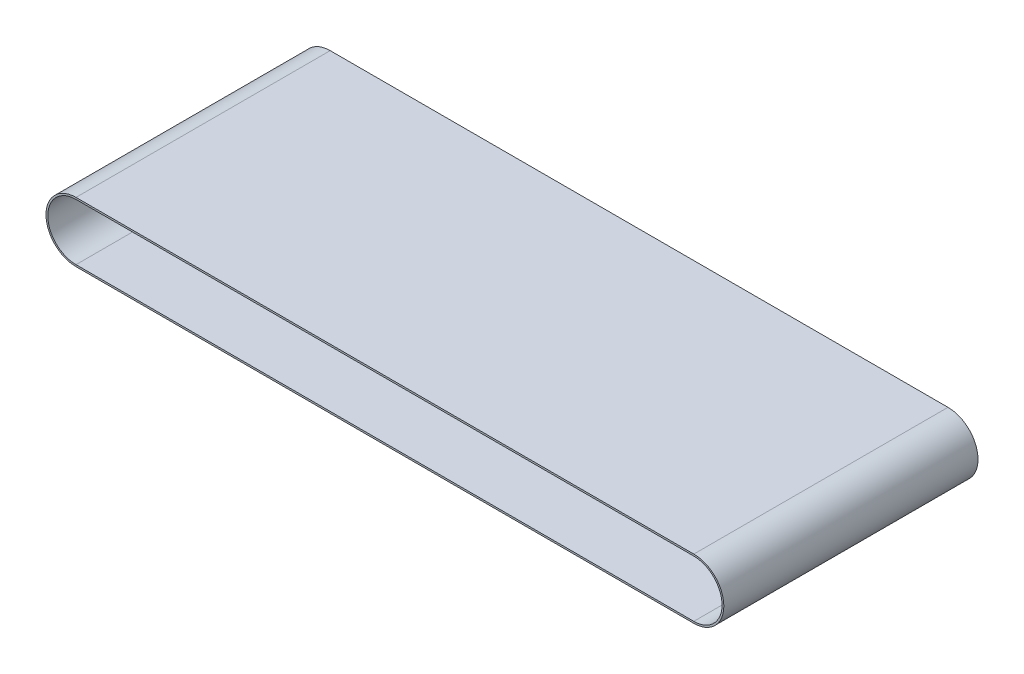
ISO-10303-21;
HEADER;
FILE_DESCRIPTION(('STEP AP214'),'2;1');
FILE_NAME('part.step','',(''),(''),'','','');
FILE_SCHEMA(('AUTOMOTIVE_DESIGN { 1 0 10303 214 1 1 1 1 }'));
ENDSEC;
DATA;
#1=APPLICATION_CONTEXT('core data for automotive mechanical design processes');
#2=APPLICATION_PROTOCOL_DEFINITION('international standard','automotive_design',2000,#1);
#3=PRODUCT_CONTEXT('',#1,'mechanical');
#4=PRODUCT('Part','Part','',(#3));
#5=PRODUCT_RELATED_PRODUCT_CATEGORY('part','',(#4));
#6=PRODUCT_DEFINITION_FORMATION('','',#4);
#7=PRODUCT_DEFINITION_CONTEXT('part definition',#1,'design');
#8=PRODUCT_DEFINITION('design','',#6,#7);
#9=PRODUCT_DEFINITION_SHAPE('','',#8);
#10=(LENGTH_UNIT() NAMED_UNIT(*) SI_UNIT(.MILLI.,.METRE.));
#11=(NAMED_UNIT(*) PLANE_ANGLE_UNIT() SI_UNIT($,.RADIAN.));
#12=(NAMED_UNIT(*) SI_UNIT($,.STERADIAN.) SOLID_ANGLE_UNIT());
#13=UNCERTAINTY_MEASURE_WITH_UNIT(LENGTH_MEASURE(1.E-05),#10,'distance_accuracy_value','');
#14=(GEOMETRIC_REPRESENTATION_CONTEXT(3) GLOBAL_UNCERTAINTY_ASSIGNED_CONTEXT((#13)) GLOBAL_UNIT_ASSIGNED_CONTEXT((#10,
#11,#12)) REPRESENTATION_CONTEXT('',''));
#15=CARTESIAN_POINT('',(0.,0.,0.));
#16=DIRECTION('',(0.,0.,1.));
#17=DIRECTION('',(1.,0.,0.));
#18=AXIS2_PLACEMENT_3D('',#15,#16,#17);
#19=CARTESIAN_POINT('',(0.,0.,-114.3));
#20=DIRECTION('',(0.,0.,1.));
#21=DIRECTION('',(1.,0.,0.));
#22=AXIS2_PLACEMENT_3D('',#19,#20,#21);
#23=CYLINDRICAL_SURFACE('',#22,26.9875);
#24=CARTESIAN_POINT('',(0.,0.,114.3));
#25=DIRECTION('',(0.,0.,1.));
#26=DIRECTION('',(1.,0.,0.));
#27=AXIS2_PLACEMENT_3D('',#24,#25,#26);
#28=CIRCLE('',#27,26.9875);
#29=CARTESIAN_POINT('',(0.,26.9875,114.3));
#30=VERTEX_POINT('',#29);
#31=CARTESIAN_POINT('',(0.,-26.9875,114.3));
#32=VERTEX_POINT('',#31);
#33=EDGE_CURVE('E148',#30,#32,#28,.T.);
#34=ORIENTED_EDGE('',*,*,#33,.F.);
#35=DIRECTION('',(0.,0.,1.));
#36=VECTOR('',#35,1.);
#37=CARTESIAN_POINT('',(0.,26.9875,-114.3));
#38=LINE('',#37,#36);
#39=CARTESIAN_POINT('',(0.,26.9875,-114.3));
#40=VERTEX_POINT('',#39);
#41=EDGE_CURVE('E11',#40,#30,#38,.T.);
#42=ORIENTED_EDGE('',*,*,#41,.F.);
#43=CARTESIAN_POINT('',(0.,0.,-114.3));
#44=DIRECTION('',(0.,0.,1.));
#45=DIRECTION('',(1.,0.,0.));
#46=AXIS2_PLACEMENT_3D('',#43,#44,#45);
#47=CIRCLE('',#46,26.9875);
#48=CARTESIAN_POINT('',(0.,-26.9875,-114.3));
#49=VERTEX_POINT('',#48);
#50=EDGE_CURVE('E154',#40,#49,#47,.T.);
#51=ORIENTED_EDGE('',*,*,#50,.T.);
#52=DIRECTION('',(0.,0.,1.));
#53=VECTOR('',#52,1.);
#54=CARTESIAN_POINT('',(0.,-26.9875,-114.3));
#55=LINE('',#54,#53);
#56=EDGE_CURVE('E42',#49,#32,#55,.T.);
#57=ORIENTED_EDGE('',*,*,#56,.T.);
#58=EDGE_LOOP('',(#34,#42,#51,#57));
#59=FACE_BOUND('',#58,.T.);
#60=ADVANCED_FACE('F39',(#59),#23,.T.);
#61=CARTESIAN_POINT('',(0.,26.9875,-114.3));
#62=DIRECTION('',(0.,1.,0.));
#63=DIRECTION('',(0.,0.,1.));
#64=AXIS2_PLACEMENT_3D('',#61,#62,#63);
#65=PLANE('',#64);
#66=DIRECTION('',(-1.,0.,0.));
#67=VECTOR('',#66,1.);
#68=CARTESIAN_POINT('',(0.,26.9875,114.3));
#69=LINE('',#68,#67);
#70=CARTESIAN_POINT('',(555.625,26.9875,114.3));
#71=VERTEX_POINT('',#70);
#72=EDGE_CURVE('E159',#71,#30,#69,.T.);
#73=ORIENTED_EDGE('',*,*,#72,.F.);
#74=DIRECTION('',(0.,0.,1.));
#75=VECTOR('',#74,1.);
#76=CARTESIAN_POINT('',(555.625,26.9875,-114.3));
#77=LINE('',#76,#75);
#78=CARTESIAN_POINT('',(555.625,26.9875,-114.3));
#79=VERTEX_POINT('',#78);
#80=EDGE_CURVE('E48',#79,#71,#77,.T.);
#81=ORIENTED_EDGE('',*,*,#80,.F.);
#82=DIRECTION('',(-1.,0.,0.));
#83=VECTOR('',#82,1.);
#84=CARTESIAN_POINT('',(0.,26.9875,-114.3));
#85=LINE('',#84,#83);
#86=EDGE_CURVE('E167',#79,#40,#85,.T.);
#87=ORIENTED_EDGE('',*,*,#86,.T.);
#88=ORIENTED_EDGE('',*,*,#41,.T.);
#89=EDGE_LOOP('',(#73,#81,#87,#88));
#90=FACE_BOUND('',#89,.T.);
#91=ADVANCED_FACE('F201',(#90),#65,.T.);
#92=CARTESIAN_POINT('',(555.625,0.,-114.3));
#93=DIRECTION('',(0.,0.,1.));
#94=DIRECTION('',(1.,0.,0.));
#95=AXIS2_PLACEMENT_3D('',#92,#93,#94);
#96=CYLINDRICAL_SURFACE('',#95,26.9875);
#97=CARTESIAN_POINT('',(555.625,0.,114.3));
#98=DIRECTION('',(0.,0.,1.));
#99=DIRECTION('',(1.,0.,0.));
#100=AXIS2_PLACEMENT_3D('',#97,#98,#99);
#101=CIRCLE('',#100,26.9875);
#102=CARTESIAN_POINT('',(555.625,-26.9875,114.3));
#103=VERTEX_POINT('',#102);
#104=EDGE_CURVE('E178',#103,#71,#101,.T.);
#105=ORIENTED_EDGE('',*,*,#104,.F.);
#106=DIRECTION('',(0.,0.,1.));
#107=VECTOR('',#106,1.);
#108=CARTESIAN_POINT('',(555.625,-26.9875,-114.3));
#109=LINE('',#108,#107);
#110=CARTESIAN_POINT('',(555.625,-26.9875,-114.3));
#111=VERTEX_POINT('',#110);
#112=EDGE_CURVE('E186',#111,#103,#109,.T.);
#113=ORIENTED_EDGE('',*,*,#112,.F.);
#114=CARTESIAN_POINT('',(555.625,0.,-114.3));
#115=DIRECTION('',(0.,0.,1.));
#116=DIRECTION('',(1.,0.,0.));
#117=AXIS2_PLACEMENT_3D('',#114,#115,#116);
#118=CIRCLE('',#117,26.9875);
#119=EDGE_CURVE('E163',#111,#79,#118,.T.);
#120=ORIENTED_EDGE('',*,*,#119,.T.);
#121=ORIENTED_EDGE('',*,*,#80,.T.);
#122=EDGE_LOOP('',(#105,#113,#120,#121));
#123=FACE_BOUND('',#122,.T.);
#124=ADVANCED_FACE('F205',(#123),#96,.T.);
#125=CARTESIAN_POINT('',(0.,-26.9875,-114.3));
#126=DIRECTION('',(0.,-1.,0.));
#127=DIRECTION('',(0.,0.,-1.));
#128=AXIS2_PLACEMENT_3D('',#125,#126,#127);
#129=PLANE('',#128);
#130=DIRECTION('',(1.,0.,0.));
#131=VECTOR('',#130,1.);
#132=CARTESIAN_POINT('',(0.,-26.9875,114.3));
#133=LINE('',#132,#131);
#134=EDGE_CURVE('E174',#32,#103,#133,.T.);
#135=ORIENTED_EDGE('',*,*,#134,.F.);
#136=ORIENTED_EDGE('',*,*,#56,.F.);
#137=DIRECTION('',(1.,0.,0.));
#138=VECTOR('',#137,1.);
#139=CARTESIAN_POINT('',(0.,-26.9875,-114.3));
#140=LINE('',#139,#138);
#141=EDGE_CURVE('E158',#49,#111,#140,.T.);
#142=ORIENTED_EDGE('',*,*,#141,.T.);
#143=ORIENTED_EDGE('',*,*,#112,.T.);
#144=EDGE_LOOP('',(#135,#136,#142,#143));
#145=FACE_BOUND('',#144,.T.);
#146=ADVANCED_FACE('F196',(#145),#129,.T.);
#147=CARTESIAN_POINT('',(0.,0.,-114.3));
#148=DIRECTION('',(0.,0.,1.));
#149=DIRECTION('',(1.,0.,0.));
#150=AXIS2_PLACEMENT_3D('',#147,#148,#149);
#151=PLANE('',#150);
#152=DIRECTION('',(1.,0.,0.));
#153=VECTOR('',#152,1.);
#154=CARTESIAN_POINT('',(0.,25.4,-114.3));
#155=LINE('',#154,#153);
#156=CARTESIAN_POINT('',(0.,25.4,-114.3));
#157=VERTEX_POINT('',#156);
#158=CARTESIAN_POINT('',(555.625,25.4,-114.3));
#159=VERTEX_POINT('',#158);
#160=EDGE_CURVE('E115',#157,#159,#155,.T.);
#161=ORIENTED_EDGE('',*,*,#160,.F.);
#162=CARTESIAN_POINT('',(0.,0.,-114.3));
#163=DIRECTION('',(0.,0.,1.));
#164=DIRECTION('',(1.,0.,0.));
#165=AXIS2_PLACEMENT_3D('',#162,#163,#164);
#166=CIRCLE('',#165,25.4);
#167=CARTESIAN_POINT('',(0.,-25.4,-114.3));
#168=VERTEX_POINT('',#167);
#169=EDGE_CURVE('E108',#157,#168,#166,.T.);
#170=ORIENTED_EDGE('',*,*,#169,.T.);
#171=DIRECTION('',(1.,0.,0.));
#172=VECTOR('',#171,1.);
#173=CARTESIAN_POINT('',(0.,-25.4,-114.3));
#174=LINE('',#173,#172);
#175=CARTESIAN_POINT('',(555.625,-25.4,-114.3));
#176=VERTEX_POINT('',#175);
#177=EDGE_CURVE('E118',#168,#176,#174,.T.);
#178=ORIENTED_EDGE('',*,*,#177,.T.);
#179=CARTESIAN_POINT('',(555.625,0.,-114.3));
#180=DIRECTION('',(0.,0.,1.));
#181=DIRECTION('',(1.,0.,0.));
#182=AXIS2_PLACEMENT_3D('',#179,#180,#181);
#183=CIRCLE('',#182,25.4);
#184=EDGE_CURVE('E56',#176,#159,#183,.T.);
#185=ORIENTED_EDGE('',*,*,#184,.T.);
#186=EDGE_LOOP('',(#161,#170,#178,#185));
#187=FACE_BOUND('',#186,.T.);
#188=ORIENTED_EDGE('',*,*,#50,.F.);
#189=ORIENTED_EDGE('',*,*,#86,.F.);
#190=ORIENTED_EDGE('',*,*,#119,.F.);
#191=ORIENTED_EDGE('',*,*,#141,.F.);
#192=EDGE_LOOP('',(#188,#189,#190,#191));
#193=FACE_BOUND('',#192,.T.);
#194=ADVANCED_FACE('F123',(#187,#193),#151,.F.);
#195=CARTESIAN_POINT('',(0.,0.,114.3));
#196=DIRECTION('',(0.,0.,1.));
#197=DIRECTION('',(1.,0.,0.));
#198=AXIS2_PLACEMENT_3D('',#195,#196,#197);
#199=PLANE('',#198);
#200=CARTESIAN_POINT('',(0.,0.,114.3));
#201=DIRECTION('',(0.,0.,1.));
#202=DIRECTION('',(1.,0.,0.));
#203=AXIS2_PLACEMENT_3D('',#200,#201,#202);
#204=CIRCLE('',#203,25.4);
#205=CARTESIAN_POINT('',(0.,25.4,114.3));
#206=VERTEX_POINT('',#205);
#207=CARTESIAN_POINT('',(0.,-25.4,114.3));
#208=VERTEX_POINT('',#207);
#209=EDGE_CURVE('E64',#206,#208,#204,.T.);
#210=ORIENTED_EDGE('',*,*,#209,.F.);
#211=DIRECTION('',(1.,0.,0.));
#212=VECTOR('',#211,1.);
#213=CARTESIAN_POINT('',(0.,25.4,114.3));
#214=LINE('',#213,#212);
#215=CARTESIAN_POINT('',(555.625,25.4,114.3));
#216=VERTEX_POINT('',#215);
#217=EDGE_CURVE('E126',#206,#216,#214,.T.);
#218=ORIENTED_EDGE('',*,*,#217,.T.);
#219=CARTESIAN_POINT('',(555.625,0.,114.3));
#220=DIRECTION('',(0.,0.,1.));
#221=DIRECTION('',(1.,0.,0.));
#222=AXIS2_PLACEMENT_3D('',#219,#220,#221);
#223=CIRCLE('',#222,25.4);
#224=CARTESIAN_POINT('',(555.625,-25.4,114.3));
#225=VERTEX_POINT('',#224);
#226=EDGE_CURVE('E130',#225,#216,#223,.T.);
#227=ORIENTED_EDGE('',*,*,#226,.F.);
#228=DIRECTION('',(1.,0.,0.));
#229=VECTOR('',#228,1.);
#230=CARTESIAN_POINT('',(0.,-25.4,114.3));
#231=LINE('',#230,#229);
#232=EDGE_CURVE('E139',#208,#225,#231,.T.);
#233=ORIENTED_EDGE('',*,*,#232,.F.);
#234=EDGE_LOOP('',(#210,#218,#227,#233));
#235=FACE_BOUND('',#234,.T.);
#236=ORIENTED_EDGE('',*,*,#33,.T.);
#237=ORIENTED_EDGE('',*,*,#134,.T.);
#238=ORIENTED_EDGE('',*,*,#104,.T.);
#239=ORIENTED_EDGE('',*,*,#72,.T.);
#240=EDGE_LOOP('',(#236,#237,#238,#239));
#241=FACE_BOUND('',#240,.T.);
#242=ADVANCED_FACE('F198',(#235,#241),#199,.T.);
#243=CARTESIAN_POINT('',(0.,0.,-114.3));
#244=DIRECTION('',(0.,0.,1.));
#245=DIRECTION('',(1.,0.,0.));
#246=AXIS2_PLACEMENT_3D('',#243,#244,#245);
#247=CYLINDRICAL_SURFACE('',#246,25.4);
#248=ORIENTED_EDGE('',*,*,#209,.T.);
#249=DIRECTION('',(0.,0.,1.));
#250=VECTOR('',#249,1.);
#251=CARTESIAN_POINT('',(0.,-25.4,-114.3));
#252=LINE('',#251,#250);
#253=EDGE_CURVE('E104',#168,#208,#252,.T.);
#254=ORIENTED_EDGE('',*,*,#253,.F.);
#255=ORIENTED_EDGE('',*,*,#169,.F.);
#256=DIRECTION('',(0.,0.,1.));
#257=VECTOR('',#256,1.);
#258=CARTESIAN_POINT('',(0.,25.4,-114.3));
#259=LINE('',#258,#257);
#260=EDGE_CURVE('E145',#157,#206,#259,.T.);
#261=ORIENTED_EDGE('',*,*,#260,.T.);
#262=EDGE_LOOP('',(#248,#254,#255,#261));
#263=FACE_BOUND('',#262,.T.);
#264=ADVANCED_FACE('F106',(#263),#247,.F.);
#265=CARTESIAN_POINT('',(0.,25.4,-114.3));
#266=DIRECTION('',(0.,-1.,0.));
#267=DIRECTION('',(1.,0.,0.));
#268=AXIS2_PLACEMENT_3D('',#265,#266,#267);
#269=PLANE('',#268);
#270=ORIENTED_EDGE('',*,*,#217,.F.);
#271=ORIENTED_EDGE('',*,*,#260,.F.);
#272=ORIENTED_EDGE('',*,*,#160,.T.);
#273=DIRECTION('',(0.,0.,1.));
#274=VECTOR('',#273,1.);
#275=CARTESIAN_POINT('',(555.625,25.4,-114.3));
#276=LINE('',#275,#274);
#277=EDGE_CURVE('E149',#159,#216,#276,.T.);
#278=ORIENTED_EDGE('',*,*,#277,.T.);
#279=EDGE_LOOP('',(#270,#271,#272,#278));
#280=FACE_BOUND('',#279,.T.);
#281=ADVANCED_FACE('F256',(#280),#269,.T.);
#282=CARTESIAN_POINT('',(555.625,0.,-114.3));
#283=DIRECTION('',(0.,0.,1.));
#284=DIRECTION('',(1.,0.,0.));
#285=AXIS2_PLACEMENT_3D('',#282,#283,#284);
#286=CYLINDRICAL_SURFACE('',#285,25.4);
#287=ORIENTED_EDGE('',*,*,#226,.T.);
#288=ORIENTED_EDGE('',*,*,#277,.F.);
#289=ORIENTED_EDGE('',*,*,#184,.F.);
#290=DIRECTION('',(0.,0.,1.));
#291=VECTOR('',#290,1.);
#292=CARTESIAN_POINT('',(555.625,-25.4,-114.3));
#293=LINE('',#292,#291);
#294=EDGE_CURVE('E114',#176,#225,#293,.T.);
#295=ORIENTED_EDGE('',*,*,#294,.T.);
#296=EDGE_LOOP('',(#287,#288,#289,#295));
#297=FACE_BOUND('',#296,.T.);
#298=ADVANCED_FACE('F265',(#297),#286,.F.);
#299=CARTESIAN_POINT('',(0.,-25.4,-114.3));
#300=DIRECTION('',(0.,-1.,0.));
#301=DIRECTION('',(1.,0.,0.));
#302=AXIS2_PLACEMENT_3D('',#299,#300,#301);
#303=PLANE('',#302);
#304=ORIENTED_EDGE('',*,*,#232,.T.);
#305=ORIENTED_EDGE('',*,*,#294,.F.);
#306=ORIENTED_EDGE('',*,*,#177,.F.);
#307=ORIENTED_EDGE('',*,*,#253,.T.);
#308=EDGE_LOOP('',(#304,#305,#306,#307));
#309=FACE_BOUND('',#308,.T.);
#310=ADVANCED_FACE('F119',(#309),#303,.F.);
#311=CLOSED_SHELL('',(#60,#91,#124,#146,#194,#242,#264,#281,#298,#310));
#312=MANIFOLD_SOLID_BREP('B2',#311);
#313=ADVANCED_BREP_SHAPE_REPRESENTATION('',(#18,#312),#14);
#314=SHAPE_DEFINITION_REPRESENTATION(#9,#313);
ENDSEC;
END-ISO-10303-21;
